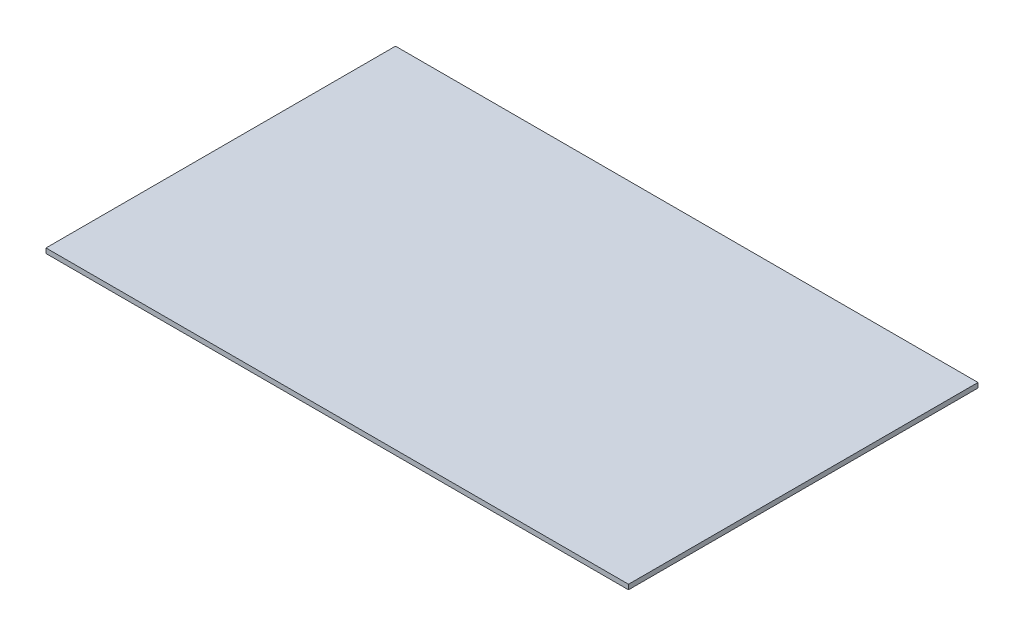
ISO-10303-21;
HEADER;
FILE_DESCRIPTION(('STEP AP214'),'2;1');
FILE_NAME('part.step','',(''),(''),'','','');
FILE_SCHEMA(('AUTOMOTIVE_DESIGN { 1 0 10303 214 1 1 1 1 }'));
ENDSEC;
DATA;
#1=APPLICATION_CONTEXT('core data for automotive mechanical design processes');
#2=APPLICATION_PROTOCOL_DEFINITION('international standard','automotive_design',2000,#1);
#3=PRODUCT_CONTEXT('',#1,'mechanical');
#4=PRODUCT('Part','Part','',(#3));
#5=PRODUCT_RELATED_PRODUCT_CATEGORY('part','',(#4));
#6=PRODUCT_DEFINITION_FORMATION('','',#4);
#7=PRODUCT_DEFINITION_CONTEXT('part definition',#1,'design');
#8=PRODUCT_DEFINITION('design','',#6,#7);
#9=PRODUCT_DEFINITION_SHAPE('','',#8);
#10=(LENGTH_UNIT() NAMED_UNIT(*) SI_UNIT(.MILLI.,.METRE.));
#11=(NAMED_UNIT(*) PLANE_ANGLE_UNIT() SI_UNIT($,.RADIAN.));
#12=(NAMED_UNIT(*) SI_UNIT($,.STERADIAN.) SOLID_ANGLE_UNIT());
#13=UNCERTAINTY_MEASURE_WITH_UNIT(LENGTH_MEASURE(1.E-05),#10,'distance_accuracy_value','');
#14=(GEOMETRIC_REPRESENTATION_CONTEXT(3) GLOBAL_UNCERTAINTY_ASSIGNED_CONTEXT((#13)) GLOBAL_UNIT_ASSIGNED_CONTEXT((#10,
#11,#12)) REPRESENTATION_CONTEXT('',''));
#15=CARTESIAN_POINT('',(0.,0.,0.));
#16=DIRECTION('',(0.,0.,1.));
#17=DIRECTION('',(1.,0.,0.));
#18=AXIS2_PLACEMENT_3D('',#15,#16,#17);
#19=CARTESIAN_POINT('',(1524.,25.4,914.4));
#20=DIRECTION('',(-1.,0.,0.));
#21=DIRECTION('',(0.,0.,1.));
#22=AXIS2_PLACEMENT_3D('',#19,#20,#21);
#23=PLANE('',#22);
#24=DIRECTION('',(0.,0.,-1.));
#25=VECTOR('',#24,1.);
#26=CARTESIAN_POINT('',(1524.,0.,914.4));
#27=LINE('',#26,#25);
#28=CARTESIAN_POINT('',(1524.,0.,914.4));
#29=VERTEX_POINT('',#28);
#30=CARTESIAN_POINT('',(1524.,0.,-914.4));
#31=VERTEX_POINT('',#30);
#32=EDGE_CURVE('E98',#29,#31,#27,.T.);
#33=ORIENTED_EDGE('',*,*,#32,.T.);
#34=DIRECTION('',(0.,-1.,0.));
#35=VECTOR('',#34,1.);
#36=CARTESIAN_POINT('',(1524.,25.4,-914.4));
#37=LINE('',#36,#35);
#38=CARTESIAN_POINT('',(1524.,25.4,-914.4));
#39=VERTEX_POINT('',#38);
#40=EDGE_CURVE('E11',#39,#31,#37,.T.);
#41=ORIENTED_EDGE('',*,*,#40,.F.);
#42=DIRECTION('',(0.,0.,-1.));
#43=VECTOR('',#42,1.);
#44=CARTESIAN_POINT('',(1524.,25.4,914.4));
#45=LINE('',#44,#43);
#46=CARTESIAN_POINT('',(1524.,25.4,914.4));
#47=VERTEX_POINT('',#46);
#48=EDGE_CURVE('E86',#47,#39,#45,.T.);
#49=ORIENTED_EDGE('',*,*,#48,.F.);
#50=DIRECTION('',(0.,-1.,0.));
#51=VECTOR('',#50,1.);
#52=CARTESIAN_POINT('',(1524.,25.4,914.4));
#53=LINE('',#52,#51);
#54=EDGE_CURVE('E94',#47,#29,#53,.T.);
#55=ORIENTED_EDGE('',*,*,#54,.T.);
#56=EDGE_LOOP('',(#33,#41,#49,#55));
#57=FACE_BOUND('',#56,.T.);
#58=ADVANCED_FACE('F35',(#57),#23,.F.);
#59=CARTESIAN_POINT('',(-1524.,25.4,-914.4));
#60=DIRECTION('',(0.,0.,1.));
#61=DIRECTION('',(1.,0.,0.));
#62=AXIS2_PLACEMENT_3D('',#59,#60,#61);
#63=PLANE('',#62);
#64=DIRECTION('',(-1.,0.,0.));
#65=VECTOR('',#64,1.);
#66=CARTESIAN_POINT('',(-1524.,0.,-914.4));
#67=LINE('',#66,#65);
#68=CARTESIAN_POINT('',(-1524.,0.,-914.4));
#69=VERTEX_POINT('',#68);
#70=EDGE_CURVE('E90',#31,#69,#67,.T.);
#71=ORIENTED_EDGE('',*,*,#70,.T.);
#72=DIRECTION('',(0.,-1.,0.));
#73=VECTOR('',#72,1.);
#74=CARTESIAN_POINT('',(-1524.,25.4,-914.4));
#75=LINE('',#74,#73);
#76=CARTESIAN_POINT('',(-1524.,25.4,-914.4));
#77=VERTEX_POINT('',#76);
#78=EDGE_CURVE('E43',#77,#69,#75,.T.);
#79=ORIENTED_EDGE('',*,*,#78,.F.);
#80=DIRECTION('',(-1.,0.,0.));
#81=VECTOR('',#80,1.);
#82=CARTESIAN_POINT('',(-1524.,25.4,-914.4));
#83=LINE('',#82,#81);
#84=EDGE_CURVE('E81',#39,#77,#83,.T.);
#85=ORIENTED_EDGE('',*,*,#84,.F.);
#86=ORIENTED_EDGE('',*,*,#40,.T.);
#87=EDGE_LOOP('',(#71,#79,#85,#86));
#88=FACE_BOUND('',#87,.T.);
#89=ADVANCED_FACE('F89',(#88),#63,.F.);
#90=CARTESIAN_POINT('',(-1524.,25.4,914.4));
#91=DIRECTION('',(1.,0.,0.));
#92=DIRECTION('',(0.,0.,-1.));
#93=AXIS2_PLACEMENT_3D('',#90,#91,#92);
#94=PLANE('',#93);
#95=DIRECTION('',(0.,0.,1.));
#96=VECTOR('',#95,1.);
#97=CARTESIAN_POINT('',(-1524.,0.,914.4));
#98=LINE('',#97,#96);
#99=CARTESIAN_POINT('',(-1524.,0.,914.4));
#100=VERTEX_POINT('',#99);
#101=EDGE_CURVE('E68',#69,#100,#98,.T.);
#102=ORIENTED_EDGE('',*,*,#101,.T.);
#103=DIRECTION('',(0.,-1.,0.));
#104=VECTOR('',#103,1.);
#105=CARTESIAN_POINT('',(-1524.,25.4,914.4));
#106=LINE('',#105,#104);
#107=CARTESIAN_POINT('',(-1524.,25.4,914.4));
#108=VERTEX_POINT('',#107);
#109=EDGE_CURVE('E91',#108,#100,#106,.T.);
#110=ORIENTED_EDGE('',*,*,#109,.F.);
#111=DIRECTION('',(0.,0.,1.));
#112=VECTOR('',#111,1.);
#113=CARTESIAN_POINT('',(-1524.,25.4,914.4));
#114=LINE('',#113,#112);
#115=EDGE_CURVE('E84',#77,#108,#114,.T.);
#116=ORIENTED_EDGE('',*,*,#115,.F.);
#117=ORIENTED_EDGE('',*,*,#78,.T.);
#118=EDGE_LOOP('',(#102,#110,#116,#117));
#119=FACE_BOUND('',#118,.T.);
#120=ADVANCED_FACE('F92',(#119),#94,.F.);
#121=CARTESIAN_POINT('',(-1524.,25.4,914.4));
#122=DIRECTION('',(0.,0.,-1.));
#123=DIRECTION('',(-1.,0.,0.));
#124=AXIS2_PLACEMENT_3D('',#121,#122,#123);
#125=PLANE('',#124);
#126=DIRECTION('',(1.,0.,0.));
#127=VECTOR('',#126,1.);
#128=CARTESIAN_POINT('',(-1524.,0.,914.4));
#129=LINE('',#128,#127);
#130=EDGE_CURVE('E74',#100,#29,#129,.T.);
#131=ORIENTED_EDGE('',*,*,#130,.T.);
#132=ORIENTED_EDGE('',*,*,#54,.F.);
#133=DIRECTION('',(1.,0.,0.));
#134=VECTOR('',#133,1.);
#135=CARTESIAN_POINT('',(-1524.,25.4,914.4));
#136=LINE('',#135,#134);
#137=EDGE_CURVE('E51',#108,#47,#136,.T.);
#138=ORIENTED_EDGE('',*,*,#137,.F.);
#139=ORIENTED_EDGE('',*,*,#109,.T.);
#140=EDGE_LOOP('',(#131,#132,#138,#139));
#141=FACE_BOUND('',#140,.T.);
#142=ADVANCED_FACE('F105',(#141),#125,.F.);
#143=CARTESIAN_POINT('',(0.,25.4,0.));
#144=DIRECTION('',(0.,-1.,0.));
#145=DIRECTION('',(0.,0.,-1.));
#146=AXIS2_PLACEMENT_3D('',#143,#144,#145);
#147=PLANE('',#146);
#148=ORIENTED_EDGE('',*,*,#48,.T.);
#149=ORIENTED_EDGE('',*,*,#84,.T.);
#150=ORIENTED_EDGE('',*,*,#115,.T.);
#151=ORIENTED_EDGE('',*,*,#137,.T.);
#152=EDGE_LOOP('',(#148,#149,#150,#151));
#153=FACE_BOUND('',#152,.T.);
#154=ADVANCED_FACE('F82',(#153),#147,.F.);
#155=CARTESIAN_POINT('',(0.,0.,0.));
#156=DIRECTION('',(0.,-1.,0.));
#157=DIRECTION('',(0.,0.,-1.));
#158=AXIS2_PLACEMENT_3D('',#155,#156,#157);
#159=PLANE('',#158);
#160=ORIENTED_EDGE('',*,*,#32,.F.);
#161=ORIENTED_EDGE('',*,*,#130,.F.);
#162=ORIENTED_EDGE('',*,*,#101,.F.);
#163=ORIENTED_EDGE('',*,*,#70,.F.);
#164=EDGE_LOOP('',(#160,#161,#162,#163));
#165=FACE_BOUND('',#164,.T.);
#166=ADVANCED_FACE('F108',(#165),#159,.T.);
#167=CLOSED_SHELL('',(#58,#89,#120,#142,#154,#166));
#168=MANIFOLD_SOLID_BREP('B2',#167);
#169=ADVANCED_BREP_SHAPE_REPRESENTATION('',(#18,#168),#14);
#170=SHAPE_DEFINITION_REPRESENTATION(#9,#169);
ENDSEC;
END-ISO-10303-21;
